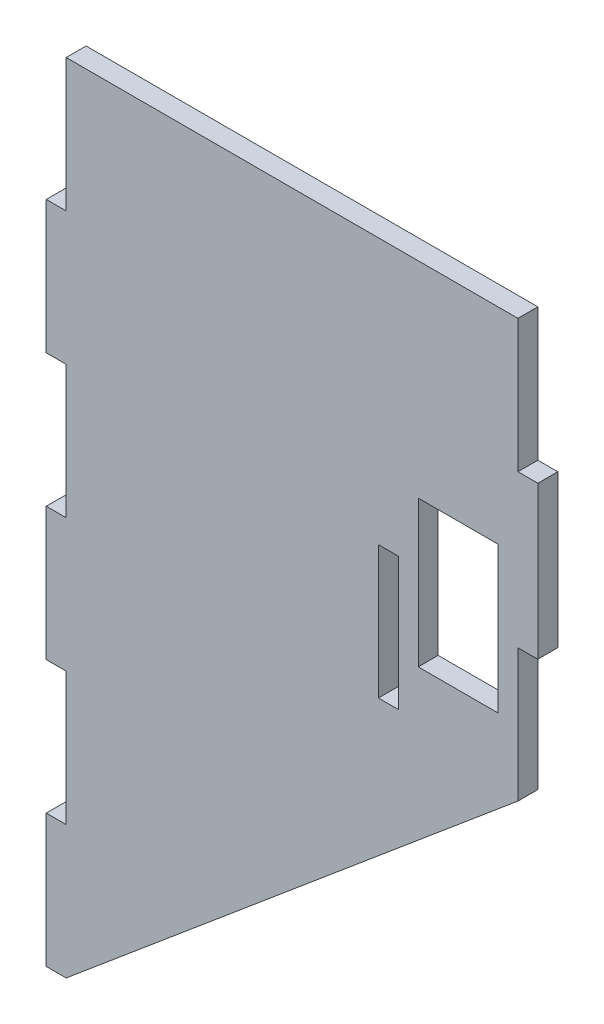
ISO-10303-21;
HEADER;
FILE_DESCRIPTION(('STEP AP214'),'2;1');
FILE_NAME('part.step','',(''),(''),'','','');
FILE_SCHEMA(('AUTOMOTIVE_DESIGN { 1 0 10303 214 1 1 1 1 }'));
ENDSEC;
DATA;
#1=APPLICATION_CONTEXT('core data for automotive mechanical design processes');
#2=APPLICATION_PROTOCOL_DEFINITION('international standard','automotive_design',2000,#1);
#3=PRODUCT_CONTEXT('',#1,'mechanical');
#4=PRODUCT('Part','Part','',(#3));
#5=PRODUCT_RELATED_PRODUCT_CATEGORY('part','',(#4));
#6=PRODUCT_DEFINITION_FORMATION('','',#4);
#7=PRODUCT_DEFINITION_CONTEXT('part definition',#1,'design');
#8=PRODUCT_DEFINITION('design','',#6,#7);
#9=PRODUCT_DEFINITION_SHAPE('','',#8);
#10=(LENGTH_UNIT() NAMED_UNIT(*) SI_UNIT(.MILLI.,.METRE.));
#11=(NAMED_UNIT(*) PLANE_ANGLE_UNIT() SI_UNIT($,.RADIAN.));
#12=(NAMED_UNIT(*) SI_UNIT($,.STERADIAN.) SOLID_ANGLE_UNIT());
#13=UNCERTAINTY_MEASURE_WITH_UNIT(LENGTH_MEASURE(1.E-05),#10,'distance_accuracy_value','');
#14=(GEOMETRIC_REPRESENTATION_CONTEXT(3) GLOBAL_UNCERTAINTY_ASSIGNED_CONTEXT((#13)) GLOBAL_UNIT_ASSIGNED_CONTEXT((#10,
#11,#12)) REPRESENTATION_CONTEXT('',''));
#15=CARTESIAN_POINT('',(0.,0.,0.));
#16=DIRECTION('',(0.,0.,1.));
#17=DIRECTION('',(1.,0.,0.));
#18=AXIS2_PLACEMENT_3D('',#15,#16,#17);
#19=CARTESIAN_POINT('',(0.,0.,3.));
#20=DIRECTION('',(0.,0.,-1.));
#21=DIRECTION('',(-1.,0.,0.));
#22=AXIS2_PLACEMENT_3D('',#19,#20,#21);
#23=PLANE('',#22);
#24=DIRECTION('',(0.,-1.,0.));
#25=VECTOR('',#24,1.);
#26=CARTESIAN_POINT('',(53.,89.0587749200552,3.));
#27=LINE('',#26,#25);
#28=CARTESIAN_POINT('',(53.,89.0587749200552,3.));
#29=VERTEX_POINT('',#28);
#30=CARTESIAN_POINT('',(53.,67.0587749200552,3.));
#31=VERTEX_POINT('',#30);
#32=EDGE_CURVE('E252',#29,#31,#27,.T.);
#33=ORIENTED_EDGE('',*,*,#32,.F.);
#34=DIRECTION('',(-1.,0.,0.));
#35=VECTOR('',#34,1.);
#36=CARTESIAN_POINT('',(53.,89.0587749200552,3.));
#37=LINE('',#36,#35);
#38=CARTESIAN_POINT('',(65.,89.0587749200552,3.));
#39=VERTEX_POINT('',#38);
#40=EDGE_CURVE('E260',#39,#29,#37,.T.);
#41=ORIENTED_EDGE('',*,*,#40,.F.);
#42=DIRECTION('',(0.,1.,0.));
#43=VECTOR('',#42,1.);
#44=CARTESIAN_POINT('',(65.,89.0587749200552,3.));
#45=LINE('',#44,#43);
#46=CARTESIAN_POINT('',(65.,67.0587749200552,3.));
#47=VERTEX_POINT('',#46);
#48=EDGE_CURVE('E257',#47,#39,#45,.T.);
#49=ORIENTED_EDGE('',*,*,#48,.F.);
#50=DIRECTION('',(1.,0.,0.));
#51=VECTOR('',#50,1.);
#52=CARTESIAN_POINT('',(53.,67.0587749200552,3.));
#53=LINE('',#52,#51);
#54=EDGE_CURVE('E254',#31,#47,#53,.T.);
#55=ORIENTED_EDGE('',*,*,#54,.F.);
#56=EDGE_LOOP('',(#33,#41,#49,#55));
#57=FACE_BOUND('',#56,.T.);
#58=DIRECTION('',(1.,0.,0.));
#59=VECTOR('',#58,1.);
#60=CARTESIAN_POINT('',(-3.00000000000001,40.,3.));
#61=LINE('',#60,#59);
#62=CARTESIAN_POINT('',(-3.00000000000001,40.,3.));
#63=VERTEX_POINT('',#62);
#64=CARTESIAN_POINT('',(0.,40.,3.));
#65=VERTEX_POINT('',#64);
#66=EDGE_CURVE('E283',#63,#65,#61,.T.);
#67=ORIENTED_EDGE('',*,*,#66,.T.);
#68=DIRECTION('',(0.,-1.,0.));
#69=VECTOR('',#68,1.);
#70=CARTESIAN_POINT('',(0.,40.,3.));
#71=LINE('',#70,#69);
#72=CARTESIAN_POINT('',(0.,20.,3.));
#73=VERTEX_POINT('',#72);
#74=EDGE_CURVE('E286',#65,#73,#71,.T.);
#75=ORIENTED_EDGE('',*,*,#74,.T.);
#76=DIRECTION('',(-1.,0.,0.));
#77=VECTOR('',#76,1.);
#78=CARTESIAN_POINT('',(0.,20.,3.));
#79=LINE('',#78,#77);
#80=CARTESIAN_POINT('',(-3.,20.,3.));
#81=VERTEX_POINT('',#80);
#82=EDGE_CURVE('E289',#73,#81,#79,.T.);
#83=ORIENTED_EDGE('',*,*,#82,.T.);
#84=DIRECTION('',(0.,-1.,0.));
#85=VECTOR('',#84,1.);
#86=CARTESIAN_POINT('',(-3.,20.,3.));
#87=LINE('',#86,#85);
#88=CARTESIAN_POINT('',(-3.,0.,3.));
#89=VERTEX_POINT('',#88);
#90=EDGE_CURVE('E291',#81,#89,#87,.T.);
#91=ORIENTED_EDGE('',*,*,#90,.T.);
#92=DIRECTION('',(1.,0.,0.));
#93=VECTOR('',#92,1.);
#94=CARTESIAN_POINT('',(-3.,0.,3.));
#95=LINE('',#94,#93);
#96=CARTESIAN_POINT('',(0.,0.,3.));
#97=VERTEX_POINT('',#96);
#98=EDGE_CURVE('E293',#89,#97,#95,.T.);
#99=ORIENTED_EDGE('',*,*,#98,.T.);
#100=DIRECTION('',(0.766044443118977,0.642787609686541,0.));
#101=VECTOR('',#100,1.);
#102=CARTESIAN_POINT('',(0.,0.,3.));
#103=LINE('',#102,#101);
#104=CARTESIAN_POINT('',(68.,57.0587749200552,3.));
#105=VERTEX_POINT('',#104);
#106=EDGE_CURVE('E295',#97,#105,#103,.T.);
#107=ORIENTED_EDGE('',*,*,#106,.T.);
#108=DIRECTION('',(0.,1.,0.));
#109=VECTOR('',#108,1.);
#110=CARTESIAN_POINT('',(68.,57.0587749200552,3.));
#111=LINE('',#110,#109);
#112=CARTESIAN_POINT('',(68.,77.0587749200552,3.));
#113=VERTEX_POINT('',#112);
#114=EDGE_CURVE('E297',#105,#113,#111,.T.);
#115=ORIENTED_EDGE('',*,*,#114,.T.);
#116=DIRECTION('',(1.,0.,0.));
#117=VECTOR('',#116,1.);
#118=CARTESIAN_POINT('',(68.,77.0587749200552,3.));
#119=LINE('',#118,#117);
#120=CARTESIAN_POINT('',(71.,77.0587749200552,3.));
#121=VERTEX_POINT('',#120);
#122=EDGE_CURVE('E299',#113,#121,#119,.T.);
#123=ORIENTED_EDGE('',*,*,#122,.T.);
#124=DIRECTION('',(0.,1.,0.));
#125=VECTOR('',#124,1.);
#126=CARTESIAN_POINT('',(71.,77.0587749200552,3.));
#127=LINE('',#126,#125);
#128=CARTESIAN_POINT('',(71.,100.,3.));
#129=VERTEX_POINT('',#128);
#130=EDGE_CURVE('E301',#121,#129,#127,.T.);
#131=ORIENTED_EDGE('',*,*,#130,.T.);
#132=DIRECTION('',(-1.,0.,0.));
#133=VECTOR('',#132,1.);
#134=CARTESIAN_POINT('',(71.,100.,3.));
#135=LINE('',#134,#133);
#136=CARTESIAN_POINT('',(68.,100.,3.));
#137=VERTEX_POINT('',#136);
#138=EDGE_CURVE('E303',#129,#137,#135,.T.);
#139=ORIENTED_EDGE('',*,*,#138,.T.);
#140=DIRECTION('',(0.,1.,0.));
#141=VECTOR('',#140,1.);
#142=CARTESIAN_POINT('',(68.,100.,3.));
#143=LINE('',#142,#141);
#144=CARTESIAN_POINT('',(68.,120.,3.));
#145=VERTEX_POINT('',#144);
#146=EDGE_CURVE('E305',#137,#145,#143,.T.);
#147=ORIENTED_EDGE('',*,*,#146,.T.);
#148=DIRECTION('',(-1.,0.,0.));
#149=VECTOR('',#148,1.);
#150=CARTESIAN_POINT('',(23.5,120.,3.));
#151=LINE('',#150,#149);
#152=CARTESIAN_POINT('',(0.,120.,3.));
#153=VERTEX_POINT('',#152);
#154=EDGE_CURVE('E307',#145,#153,#151,.T.);
#155=ORIENTED_EDGE('',*,*,#154,.T.);
#156=DIRECTION('',(0.,-1.,0.));
#157=VECTOR('',#156,1.);
#158=CARTESIAN_POINT('',(0.,100.,3.));
#159=LINE('',#158,#157);
#160=CARTESIAN_POINT('',(0.,100.,3.));
#161=VERTEX_POINT('',#160);
#162=EDGE_CURVE('E309',#153,#161,#159,.T.);
#163=ORIENTED_EDGE('',*,*,#162,.T.);
#164=DIRECTION('',(-1.,0.,0.));
#165=VECTOR('',#164,1.);
#166=CARTESIAN_POINT('',(-3.00000000000001,100.,3.));
#167=LINE('',#166,#165);
#168=CARTESIAN_POINT('',(-3.00000000000001,100.,3.));
#169=VERTEX_POINT('',#168);
#170=EDGE_CURVE('E311',#161,#169,#167,.T.);
#171=ORIENTED_EDGE('',*,*,#170,.T.);
#172=DIRECTION('',(0.,-1.,0.));
#173=VECTOR('',#172,1.);
#174=CARTESIAN_POINT('',(-3.,80.,3.));
#175=LINE('',#174,#173);
#176=CARTESIAN_POINT('',(-3.,80.,3.));
#177=VERTEX_POINT('',#176);
#178=EDGE_CURVE('E313',#169,#177,#175,.T.);
#179=ORIENTED_EDGE('',*,*,#178,.T.);
#180=DIRECTION('',(1.,0.,0.));
#181=VECTOR('',#180,1.);
#182=CARTESIAN_POINT('',(0.,80.,3.));
#183=LINE('',#182,#181);
#184=CARTESIAN_POINT('',(0.,80.,3.));
#185=VERTEX_POINT('',#184);
#186=EDGE_CURVE('E315',#177,#185,#183,.T.);
#187=ORIENTED_EDGE('',*,*,#186,.T.);
#188=DIRECTION('',(0.,-1.,0.));
#189=VECTOR('',#188,1.);
#190=CARTESIAN_POINT('',(0.,60.,3.));
#191=LINE('',#190,#189);
#192=CARTESIAN_POINT('',(0.,60.,3.));
#193=VERTEX_POINT('',#192);
#194=EDGE_CURVE('E317',#185,#193,#191,.T.);
#195=ORIENTED_EDGE('',*,*,#194,.T.);
#196=DIRECTION('',(-1.,0.,0.));
#197=VECTOR('',#196,1.);
#198=CARTESIAN_POINT('',(-3.00000000000001,60.,3.));
#199=LINE('',#198,#197);
#200=CARTESIAN_POINT('',(-3.00000000000001,60.,3.));
#201=VERTEX_POINT('',#200);
#202=EDGE_CURVE('E319',#193,#201,#199,.T.);
#203=ORIENTED_EDGE('',*,*,#202,.T.);
#204=DIRECTION('',(0.,-1.,0.));
#205=VECTOR('',#204,1.);
#206=CARTESIAN_POINT('',(-3.00000000000001,60.,3.));
#207=LINE('',#206,#205);
#208=EDGE_CURVE('E321',#201,#63,#207,.T.);
#209=ORIENTED_EDGE('',*,*,#208,.T.);
#210=EDGE_LOOP('',(#67,#75,#83,#91,#99,#107,#115,#123,#131,#139,#147,#155,#163,#171,#179,#187,
#195,#203,#209));
#211=FACE_BOUND('',#210,.T.);
#212=DIRECTION('',(0.,1.,0.));
#213=VECTOR('',#212,1.);
#214=CARTESIAN_POINT('',(50.,60.,3.));
#215=LINE('',#214,#213);
#216=CARTESIAN_POINT('',(50.,60.,3.));
#217=VERTEX_POINT('',#216);
#218=CARTESIAN_POINT('',(50.,80.,3.));
#219=VERTEX_POINT('',#218);
#220=EDGE_CURVE('E216',#217,#219,#215,.T.);
#221=ORIENTED_EDGE('',*,*,#220,.F.);
#222=DIRECTION('',(1.,0.,0.));
#223=VECTOR('',#222,1.);
#224=CARTESIAN_POINT('',(50.,60.,3.));
#225=LINE('',#224,#223);
#226=CARTESIAN_POINT('',(47.,60.,3.));
#227=VERTEX_POINT('',#226);
#228=EDGE_CURVE('E238',#227,#217,#225,.T.);
#229=ORIENTED_EDGE('',*,*,#228,.F.);
#230=DIRECTION('',(0.,-1.,0.));
#231=VECTOR('',#230,1.);
#232=CARTESIAN_POINT('',(47.,60.,3.));
#233=LINE('',#232,#231);
#234=CARTESIAN_POINT('',(47.,80.,3.));
#235=VERTEX_POINT('',#234);
#236=EDGE_CURVE('E236',#235,#227,#233,.T.);
#237=ORIENTED_EDGE('',*,*,#236,.F.);
#238=DIRECTION('',(-1.,0.,0.));
#239=VECTOR('',#238,1.);
#240=CARTESIAN_POINT('',(47.,80.,3.));
#241=LINE('',#240,#239);
#242=EDGE_CURVE('E224',#219,#235,#241,.T.);
#243=ORIENTED_EDGE('',*,*,#242,.F.);
#244=EDGE_LOOP('',(#221,#229,#237,#243));
#245=FACE_BOUND('',#244,.T.);
#246=ADVANCED_FACE('F37',(#57,#211,#245),#23,.F.);
#247=CARTESIAN_POINT('',(0.,0.,0.));
#248=DIRECTION('',(0.,0.,-1.));
#249=DIRECTION('',(-1.,0.,0.));
#250=AXIS2_PLACEMENT_3D('',#247,#248,#249);
#251=PLANE('',#250);
#252=DIRECTION('',(1.,0.,0.));
#253=VECTOR('',#252,1.);
#254=CARTESIAN_POINT('',(-3.00000000000001,40.,0.));
#255=LINE('',#254,#253);
#256=CARTESIAN_POINT('',(-3.00000000000001,40.,0.));
#257=VERTEX_POINT('',#256);
#258=CARTESIAN_POINT('',(0.,40.,0.));
#259=VERTEX_POINT('',#258);
#260=EDGE_CURVE('E282',#257,#259,#255,.T.);
#261=ORIENTED_EDGE('',*,*,#260,.F.);
#262=DIRECTION('',(0.,-1.,0.));
#263=VECTOR('',#262,1.);
#264=CARTESIAN_POINT('',(-3.00000000000001,60.,0.));
#265=LINE('',#264,#263);
#266=CARTESIAN_POINT('',(-3.00000000000001,60.,0.));
#267=VERTEX_POINT('',#266);
#268=EDGE_CURVE('E287',#267,#257,#265,.T.);
#269=ORIENTED_EDGE('',*,*,#268,.F.);
#270=DIRECTION('',(-1.,0.,0.));
#271=VECTOR('',#270,1.);
#272=CARTESIAN_POINT('',(-3.00000000000001,60.,0.));
#273=LINE('',#272,#271);
#274=CARTESIAN_POINT('',(0.,60.,0.));
#275=VERTEX_POINT('',#274);
#276=EDGE_CURVE('E359',#275,#267,#273,.T.);
#277=ORIENTED_EDGE('',*,*,#276,.F.);
#278=DIRECTION('',(0.,-1.,0.));
#279=VECTOR('',#278,1.);
#280=CARTESIAN_POINT('',(0.,60.,0.));
#281=LINE('',#280,#279);
#282=CARTESIAN_POINT('',(0.,80.,0.));
#283=VERTEX_POINT('',#282);
#284=EDGE_CURVE('E357',#283,#275,#281,.T.);
#285=ORIENTED_EDGE('',*,*,#284,.F.);
#286=DIRECTION('',(1.,0.,0.));
#287=VECTOR('',#286,1.);
#288=CARTESIAN_POINT('',(0.,80.,0.));
#289=LINE('',#288,#287);
#290=CARTESIAN_POINT('',(-3.,80.,0.));
#291=VERTEX_POINT('',#290);
#292=EDGE_CURVE('E355',#291,#283,#289,.T.);
#293=ORIENTED_EDGE('',*,*,#292,.F.);
#294=DIRECTION('',(0.,-1.,0.));
#295=VECTOR('',#294,1.);
#296=CARTESIAN_POINT('',(-3.,80.,0.));
#297=LINE('',#296,#295);
#298=CARTESIAN_POINT('',(-3.00000000000001,100.,0.));
#299=VERTEX_POINT('',#298);
#300=EDGE_CURVE('E353',#299,#291,#297,.T.);
#301=ORIENTED_EDGE('',*,*,#300,.F.);
#302=DIRECTION('',(-1.,0.,0.));
#303=VECTOR('',#302,1.);
#304=CARTESIAN_POINT('',(-3.00000000000001,100.,0.));
#305=LINE('',#304,#303);
#306=CARTESIAN_POINT('',(0.,100.,0.));
#307=VERTEX_POINT('',#306);
#308=EDGE_CURVE('E351',#307,#299,#305,.T.);
#309=ORIENTED_EDGE('',*,*,#308,.F.);
#310=DIRECTION('',(0.,-1.,0.));
#311=VECTOR('',#310,1.);
#312=CARTESIAN_POINT('',(0.,100.,0.));
#313=LINE('',#312,#311);
#314=CARTESIAN_POINT('',(0.,120.,0.));
#315=VERTEX_POINT('',#314);
#316=EDGE_CURVE('E349',#315,#307,#313,.T.);
#317=ORIENTED_EDGE('',*,*,#316,.F.);
#318=DIRECTION('',(-1.,0.,0.));
#319=VECTOR('',#318,1.);
#320=CARTESIAN_POINT('',(0.,120.,0.));
#321=LINE('',#320,#319);
#322=CARTESIAN_POINT('',(68.,120.,0.));
#323=VERTEX_POINT('',#322);
#324=EDGE_CURVE('E347',#323,#315,#321,.T.);
#325=ORIENTED_EDGE('',*,*,#324,.F.);
#326=DIRECTION('',(0.,1.,0.));
#327=VECTOR('',#326,1.);
#328=CARTESIAN_POINT('',(68.,100.,0.));
#329=LINE('',#328,#327);
#330=CARTESIAN_POINT('',(68.,100.,0.));
#331=VERTEX_POINT('',#330);
#332=EDGE_CURVE('E344',#331,#323,#329,.T.);
#333=ORIENTED_EDGE('',*,*,#332,.F.);
#334=DIRECTION('',(-1.,0.,0.));
#335=VECTOR('',#334,1.);
#336=CARTESIAN_POINT('',(71.,100.,0.));
#337=LINE('',#336,#335);
#338=CARTESIAN_POINT('',(71.,100.,0.));
#339=VERTEX_POINT('',#338);
#340=EDGE_CURVE('E342',#339,#331,#337,.T.);
#341=ORIENTED_EDGE('',*,*,#340,.F.);
#342=DIRECTION('',(0.,1.,0.));
#343=VECTOR('',#342,1.);
#344=CARTESIAN_POINT('',(71.,77.0587749200552,0.));
#345=LINE('',#344,#343);
#346=CARTESIAN_POINT('',(71.,77.0587749200552,0.));
#347=VERTEX_POINT('',#346);
#348=EDGE_CURVE('E340',#347,#339,#345,.T.);
#349=ORIENTED_EDGE('',*,*,#348,.F.);
#350=DIRECTION('',(1.,0.,0.));
#351=VECTOR('',#350,1.);
#352=CARTESIAN_POINT('',(68.,77.0587749200552,0.));
#353=LINE('',#352,#351);
#354=CARTESIAN_POINT('',(68.,77.0587749200552,0.));
#355=VERTEX_POINT('',#354);
#356=EDGE_CURVE('E338',#355,#347,#353,.T.);
#357=ORIENTED_EDGE('',*,*,#356,.F.);
#358=DIRECTION('',(0.,1.,0.));
#359=VECTOR('',#358,1.);
#360=CARTESIAN_POINT('',(68.,57.0587749200552,0.));
#361=LINE('',#360,#359);
#362=CARTESIAN_POINT('',(68.,57.0587749200552,0.));
#363=VERTEX_POINT('',#362);
#364=EDGE_CURVE('E336',#363,#355,#361,.T.);
#365=ORIENTED_EDGE('',*,*,#364,.F.);
#366=DIRECTION('',(0.766044443118977,0.642787609686541,0.));
#367=VECTOR('',#366,1.);
#368=CARTESIAN_POINT('',(0.,0.,0.));
#369=LINE('',#368,#367);
#370=CARTESIAN_POINT('',(0.,0.,0.));
#371=VERTEX_POINT('',#370);
#372=EDGE_CURVE('E334',#371,#363,#369,.T.);
#373=ORIENTED_EDGE('',*,*,#372,.F.);
#374=DIRECTION('',(1.,0.,0.));
#375=VECTOR('',#374,1.);
#376=CARTESIAN_POINT('',(-3.,0.,0.));
#377=LINE('',#376,#375);
#378=CARTESIAN_POINT('',(-3.,0.,0.));
#379=VERTEX_POINT('',#378);
#380=EDGE_CURVE('E332',#379,#371,#377,.T.);
#381=ORIENTED_EDGE('',*,*,#380,.F.);
#382=DIRECTION('',(0.,-1.,0.));
#383=VECTOR('',#382,1.);
#384=CARTESIAN_POINT('',(-3.,20.,0.));
#385=LINE('',#384,#383);
#386=CARTESIAN_POINT('',(-3.,20.,0.));
#387=VERTEX_POINT('',#386);
#388=EDGE_CURVE('E330',#387,#379,#385,.T.);
#389=ORIENTED_EDGE('',*,*,#388,.F.);
#390=DIRECTION('',(-1.,0.,0.));
#391=VECTOR('',#390,1.);
#392=CARTESIAN_POINT('',(0.,20.,0.));
#393=LINE('',#392,#391);
#394=CARTESIAN_POINT('',(0.,20.,0.));
#395=VERTEX_POINT('',#394);
#396=EDGE_CURVE('E328',#395,#387,#393,.T.);
#397=ORIENTED_EDGE('',*,*,#396,.F.);
#398=DIRECTION('',(0.,-1.,0.));
#399=VECTOR('',#398,1.);
#400=CARTESIAN_POINT('',(0.,40.,0.));
#401=LINE('',#400,#399);
#402=EDGE_CURVE('E326',#259,#395,#401,.T.);
#403=ORIENTED_EDGE('',*,*,#402,.F.);
#404=EDGE_LOOP('',(#261,#269,#277,#285,#293,#301,#309,#317,#325,#333,#341,#349,#357,#365,#373,
#381,#389,#397,#403));
#405=FACE_BOUND('',#404,.T.);
#406=DIRECTION('',(-1.,0.,0.));
#407=VECTOR('',#406,1.);
#408=CARTESIAN_POINT('',(53.,89.0587749200552,0.));
#409=LINE('',#408,#407);
#410=CARTESIAN_POINT('',(65.,89.0587749200552,0.));
#411=VERTEX_POINT('',#410);
#412=CARTESIAN_POINT('',(53.,89.0587749200552,0.));
#413=VERTEX_POINT('',#412);
#414=EDGE_CURVE('E255',#411,#413,#409,.T.);
#415=ORIENTED_EDGE('',*,*,#414,.T.);
#416=DIRECTION('',(0.,-1.,0.));
#417=VECTOR('',#416,1.);
#418=CARTESIAN_POINT('',(53.,89.0587749200552,0.));
#419=LINE('',#418,#417);
#420=CARTESIAN_POINT('',(53.,67.0587749200552,0.));
#421=VERTEX_POINT('',#420);
#422=EDGE_CURVE('E232',#413,#421,#419,.T.);
#423=ORIENTED_EDGE('',*,*,#422,.T.);
#424=DIRECTION('',(1.,0.,0.));
#425=VECTOR('',#424,1.);
#426=CARTESIAN_POINT('',(53.,67.0587749200552,0.));
#427=LINE('',#426,#425);
#428=CARTESIAN_POINT('',(65.,67.0587749200552,0.));
#429=VERTEX_POINT('',#428);
#430=EDGE_CURVE('E265',#421,#429,#427,.T.);
#431=ORIENTED_EDGE('',*,*,#430,.T.);
#432=DIRECTION('',(0.,1.,0.));
#433=VECTOR('',#432,1.);
#434=CARTESIAN_POINT('',(65.,89.0587749200552,0.));
#435=LINE('',#434,#433);
#436=EDGE_CURVE('E268',#429,#411,#435,.T.);
#437=ORIENTED_EDGE('',*,*,#436,.T.);
#438=EDGE_LOOP('',(#415,#423,#431,#437));
#439=FACE_BOUND('',#438,.T.);
#440=DIRECTION('',(1.,0.,0.));
#441=VECTOR('',#440,1.);
#442=CARTESIAN_POINT('',(50.,60.,0.));
#443=LINE('',#442,#441);
#444=CARTESIAN_POINT('',(47.,60.,0.));
#445=VERTEX_POINT('',#444);
#446=CARTESIAN_POINT('',(50.,60.,0.));
#447=VERTEX_POINT('',#446);
#448=EDGE_CURVE('E225',#445,#447,#443,.T.);
#449=ORIENTED_EDGE('',*,*,#448,.T.);
#450=DIRECTION('',(0.,1.,0.));
#451=VECTOR('',#450,1.);
#452=CARTESIAN_POINT('',(50.,60.,0.));
#453=LINE('',#452,#451);
#454=CARTESIAN_POINT('',(50.,80.,0.));
#455=VERTEX_POINT('',#454);
#456=EDGE_CURVE('E60',#447,#455,#453,.T.);
#457=ORIENTED_EDGE('',*,*,#456,.T.);
#458=DIRECTION('',(-1.,0.,0.));
#459=VECTOR('',#458,1.);
#460=CARTESIAN_POINT('',(47.,80.,0.));
#461=LINE('',#460,#459);
#462=CARTESIAN_POINT('',(47.,80.,0.));
#463=VERTEX_POINT('',#462);
#464=EDGE_CURVE('E231',#455,#463,#461,.T.);
#465=ORIENTED_EDGE('',*,*,#464,.T.);
#466=DIRECTION('',(0.,-1.,0.));
#467=VECTOR('',#466,1.);
#468=CARTESIAN_POINT('',(47.,60.,0.));
#469=LINE('',#468,#467);
#470=EDGE_CURVE('E244',#463,#445,#469,.T.);
#471=ORIENTED_EDGE('',*,*,#470,.T.);
#472=EDGE_LOOP('',(#449,#457,#465,#471));
#473=FACE_BOUND('',#472,.T.);
#474=ADVANCED_FACE('F422',(#405,#439,#473),#251,.T.);
#475=CARTESIAN_POINT('',(-3.00000000000001,40.,3.));
#476=DIRECTION('',(0.,1.,0.));
#477=DIRECTION('',(0.,0.,1.));
#478=AXIS2_PLACEMENT_3D('',#475,#476,#477);
#479=PLANE('',#478);
#480=ORIENTED_EDGE('',*,*,#260,.T.);
#481=DIRECTION('',(0.,0.,-1.));
#482=VECTOR('',#481,1.);
#483=CARTESIAN_POINT('',(0.,40.,3.));
#484=LINE('',#483,#482);
#485=EDGE_CURVE('E11',#65,#259,#484,.T.);
#486=ORIENTED_EDGE('',*,*,#485,.F.);
#487=ORIENTED_EDGE('',*,*,#66,.F.);
#488=DIRECTION('',(0.,0.,-1.));
#489=VECTOR('',#488,1.);
#490=CARTESIAN_POINT('',(-3.00000000000001,40.,3.));
#491=LINE('',#490,#489);
#492=EDGE_CURVE('E323',#63,#257,#491,.T.);
#493=ORIENTED_EDGE('',*,*,#492,.T.);
#494=EDGE_LOOP('',(#480,#486,#487,#493));
#495=FACE_BOUND('',#494,.T.);
#496=ADVANCED_FACE('F39',(#495),#479,.F.);
#497=CARTESIAN_POINT('',(0.,40.,3.));
#498=DIRECTION('',(1.,0.,0.));
#499=DIRECTION('',(0.,0.,-1.));
#500=AXIS2_PLACEMENT_3D('',#497,#498,#499);
#501=PLANE('',#500);
#502=ORIENTED_EDGE('',*,*,#402,.T.);
#503=DIRECTION('',(0.,0.,-1.));
#504=VECTOR('',#503,1.);
#505=CARTESIAN_POINT('',(0.,20.,3.));
#506=LINE('',#505,#504);
#507=EDGE_CURVE('E45',#73,#395,#506,.T.);
#508=ORIENTED_EDGE('',*,*,#507,.F.);
#509=ORIENTED_EDGE('',*,*,#74,.F.);
#510=ORIENTED_EDGE('',*,*,#485,.T.);
#511=EDGE_LOOP('',(#502,#508,#509,#510));
#512=FACE_BOUND('',#511,.T.);
#513=ADVANCED_FACE('F439',(#512),#501,.F.);
#514=CARTESIAN_POINT('',(0.,20.,3.));
#515=DIRECTION('',(0.,-1.,0.));
#516=DIRECTION('',(1.,0.,0.));
#517=AXIS2_PLACEMENT_3D('',#514,#515,#516);
#518=PLANE('',#517);
#519=ORIENTED_EDGE('',*,*,#396,.T.);
#520=DIRECTION('',(0.,0.,-1.));
#521=VECTOR('',#520,1.);
#522=CARTESIAN_POINT('',(-3.,20.,3.));
#523=LINE('',#522,#521);
#524=EDGE_CURVE('E409',#81,#387,#523,.T.);
#525=ORIENTED_EDGE('',*,*,#524,.F.);
#526=ORIENTED_EDGE('',*,*,#82,.F.);
#527=ORIENTED_EDGE('',*,*,#507,.T.);
#528=EDGE_LOOP('',(#519,#525,#526,#527));
#529=FACE_BOUND('',#528,.T.);
#530=ADVANCED_FACE('F416',(#529),#518,.F.);
#531=CARTESIAN_POINT('',(-3.,20.,3.));
#532=DIRECTION('',(1.,0.,0.));
#533=DIRECTION('',(0.,1.,0.));
#534=AXIS2_PLACEMENT_3D('',#531,#532,#533);
#535=PLANE('',#534);
#536=ORIENTED_EDGE('',*,*,#388,.T.);
#537=DIRECTION('',(0.,0.,-1.));
#538=VECTOR('',#537,1.);
#539=CARTESIAN_POINT('',(-3.,0.,3.));
#540=LINE('',#539,#538);
#541=EDGE_CURVE('E406',#89,#379,#540,.T.);
#542=ORIENTED_EDGE('',*,*,#541,.F.);
#543=ORIENTED_EDGE('',*,*,#90,.F.);
#544=ORIENTED_EDGE('',*,*,#524,.T.);
#545=EDGE_LOOP('',(#536,#542,#543,#544));
#546=FACE_BOUND('',#545,.T.);
#547=ADVANCED_FACE('F428',(#546),#535,.F.);
#548=CARTESIAN_POINT('',(-3.,0.,3.));
#549=DIRECTION('',(0.,1.,0.));
#550=DIRECTION('',(0.,0.,1.));
#551=AXIS2_PLACEMENT_3D('',#548,#549,#550);
#552=PLANE('',#551);
#553=ORIENTED_EDGE('',*,*,#380,.T.);
#554=DIRECTION('',(0.,0.,-1.));
#555=VECTOR('',#554,1.);
#556=CARTESIAN_POINT('',(0.,0.,3.));
#557=LINE('',#556,#555);
#558=EDGE_CURVE('E403',#97,#371,#557,.T.);
#559=ORIENTED_EDGE('',*,*,#558,.F.);
#560=ORIENTED_EDGE('',*,*,#98,.F.);
#561=ORIENTED_EDGE('',*,*,#541,.T.);
#562=EDGE_LOOP('',(#553,#559,#560,#561));
#563=FACE_BOUND('',#562,.T.);
#564=ADVANCED_FACE('F432',(#563),#552,.F.);
#565=CARTESIAN_POINT('',(0.,0.,3.));
#566=DIRECTION('',(-0.642787609686541,0.766044443118977,0.));
#567=DIRECTION('',(-0.766044443118977,-0.642787609686541,0.));
#568=AXIS2_PLACEMENT_3D('',#565,#566,#567);
#569=PLANE('',#568);
#570=ORIENTED_EDGE('',*,*,#372,.T.);
#571=DIRECTION('',(0.,0.,-1.));
#572=VECTOR('',#571,1.);
#573=CARTESIAN_POINT('',(68.,57.0587749200552,3.));
#574=LINE('',#573,#572);
#575=EDGE_CURVE('E400',#105,#363,#574,.T.);
#576=ORIENTED_EDGE('',*,*,#575,.F.);
#577=ORIENTED_EDGE('',*,*,#106,.F.);
#578=ORIENTED_EDGE('',*,*,#558,.T.);
#579=EDGE_LOOP('',(#570,#576,#577,#578));
#580=FACE_BOUND('',#579,.T.);
#581=ADVANCED_FACE('F506',(#580),#569,.F.);
#582=CARTESIAN_POINT('',(68.,57.0587749200552,3.));
#583=DIRECTION('',(-1.,0.,0.));
#584=DIRECTION('',(0.,0.,1.));
#585=AXIS2_PLACEMENT_3D('',#582,#583,#584);
#586=PLANE('',#585);
#587=ORIENTED_EDGE('',*,*,#364,.T.);
#588=DIRECTION('',(0.,0.,-1.));
#589=VECTOR('',#588,1.);
#590=CARTESIAN_POINT('',(68.,77.0587749200552,3.));
#591=LINE('',#590,#589);
#592=EDGE_CURVE('E397',#113,#355,#591,.T.);
#593=ORIENTED_EDGE('',*,*,#592,.F.);
#594=ORIENTED_EDGE('',*,*,#114,.F.);
#595=ORIENTED_EDGE('',*,*,#575,.T.);
#596=EDGE_LOOP('',(#587,#593,#594,#595));
#597=FACE_BOUND('',#596,.T.);
#598=ADVANCED_FACE('F503',(#597),#586,.F.);
#599=CARTESIAN_POINT('',(68.,77.0587749200552,3.));
#600=DIRECTION('',(0.,1.,0.));
#601=DIRECTION('',(-1.,0.,0.));
#602=AXIS2_PLACEMENT_3D('',#599,#600,#601);
#603=PLANE('',#602);
#604=ORIENTED_EDGE('',*,*,#356,.T.);
#605=DIRECTION('',(0.,0.,-1.));
#606=VECTOR('',#605,1.);
#607=CARTESIAN_POINT('',(71.,77.0587749200552,3.));
#608=LINE('',#607,#606);
#609=EDGE_CURVE('E394',#121,#347,#608,.T.);
#610=ORIENTED_EDGE('',*,*,#609,.F.);
#611=ORIENTED_EDGE('',*,*,#122,.F.);
#612=ORIENTED_EDGE('',*,*,#592,.T.);
#613=EDGE_LOOP('',(#604,#610,#611,#612));
#614=FACE_BOUND('',#613,.T.);
#615=ADVANCED_FACE('F499',(#614),#603,.F.);
#616=CARTESIAN_POINT('',(71.,77.0587749200552,3.));
#617=DIRECTION('',(-1.,0.,0.));
#618=DIRECTION('',(0.,0.,1.));
#619=AXIS2_PLACEMENT_3D('',#616,#617,#618);
#620=PLANE('',#619);
#621=ORIENTED_EDGE('',*,*,#348,.T.);
#622=DIRECTION('',(0.,0.,-1.));
#623=VECTOR('',#622,1.);
#624=CARTESIAN_POINT('',(71.,100.,3.));
#625=LINE('',#624,#623);
#626=EDGE_CURVE('E391',#129,#339,#625,.T.);
#627=ORIENTED_EDGE('',*,*,#626,.F.);
#628=ORIENTED_EDGE('',*,*,#130,.F.);
#629=ORIENTED_EDGE('',*,*,#609,.T.);
#630=EDGE_LOOP('',(#621,#627,#628,#629));
#631=FACE_BOUND('',#630,.T.);
#632=ADVANCED_FACE('F495',(#631),#620,.F.);
#633=CARTESIAN_POINT('',(71.,100.,3.));
#634=DIRECTION('',(0.,-1.,0.));
#635=DIRECTION('',(0.,0.,-1.));
#636=AXIS2_PLACEMENT_3D('',#633,#634,#635);
#637=PLANE('',#636);
#638=ORIENTED_EDGE('',*,*,#340,.T.);
#639=DIRECTION('',(0.,0.,-1.));
#640=VECTOR('',#639,1.);
#641=CARTESIAN_POINT('',(68.,100.,3.));
#642=LINE('',#641,#640);
#643=EDGE_CURVE('E388',#137,#331,#642,.T.);
#644=ORIENTED_EDGE('',*,*,#643,.F.);
#645=ORIENTED_EDGE('',*,*,#138,.F.);
#646=ORIENTED_EDGE('',*,*,#626,.T.);
#647=EDGE_LOOP('',(#638,#644,#645,#646));
#648=FACE_BOUND('',#647,.T.);
#649=ADVANCED_FACE('F490',(#648),#637,.F.);
#650=CARTESIAN_POINT('',(68.,100.,3.));
#651=DIRECTION('',(-1.,0.,0.));
#652=DIRECTION('',(0.,0.,1.));
#653=AXIS2_PLACEMENT_3D('',#650,#651,#652);
#654=PLANE('',#653);
#655=ORIENTED_EDGE('',*,*,#332,.T.);
#656=DIRECTION('',(0.,0.,-1.));
#657=VECTOR('',#656,1.);
#658=CARTESIAN_POINT('',(68.,120.,3.));
#659=LINE('',#658,#657);
#660=EDGE_CURVE('E385',#145,#323,#659,.T.);
#661=ORIENTED_EDGE('',*,*,#660,.F.);
#662=ORIENTED_EDGE('',*,*,#146,.F.);
#663=ORIENTED_EDGE('',*,*,#643,.T.);
#664=EDGE_LOOP('',(#655,#661,#662,#663));
#665=FACE_BOUND('',#664,.T.);
#666=ADVANCED_FACE('F484',(#665),#654,.F.);
#667=CARTESIAN_POINT('',(0.,120.,3.));
#668=DIRECTION('',(0.,-1.,0.));
#669=DIRECTION('',(1.,0.,0.));
#670=AXIS2_PLACEMENT_3D('',#667,#668,#669);
#671=PLANE('',#670);
#672=ORIENTED_EDGE('',*,*,#324,.T.);
#673=DIRECTION('',(0.,0.,-1.));
#674=VECTOR('',#673,1.);
#675=CARTESIAN_POINT('',(0.,120.,3.));
#676=LINE('',#675,#674);
#677=EDGE_CURVE('E382',#153,#315,#676,.T.);
#678=ORIENTED_EDGE('',*,*,#677,.F.);
#679=ORIENTED_EDGE('',*,*,#154,.F.);
#680=ORIENTED_EDGE('',*,*,#660,.T.);
#681=EDGE_LOOP('',(#672,#678,#679,#680));
#682=FACE_BOUND('',#681,.T.);
#683=ADVANCED_FACE('F480',(#682),#671,.F.);
#684=CARTESIAN_POINT('',(0.,100.,3.));
#685=DIRECTION('',(1.,0.,0.));
#686=DIRECTION('',(0.,0.,-1.));
#687=AXIS2_PLACEMENT_3D('',#684,#685,#686);
#688=PLANE('',#687);
#689=ORIENTED_EDGE('',*,*,#316,.T.);
#690=DIRECTION('',(0.,0.,-1.));
#691=VECTOR('',#690,1.);
#692=CARTESIAN_POINT('',(0.,100.,3.));
#693=LINE('',#692,#691);
#694=EDGE_CURVE('E379',#161,#307,#693,.T.);
#695=ORIENTED_EDGE('',*,*,#694,.F.);
#696=ORIENTED_EDGE('',*,*,#162,.F.);
#697=ORIENTED_EDGE('',*,*,#677,.T.);
#698=EDGE_LOOP('',(#689,#695,#696,#697));
#699=FACE_BOUND('',#698,.T.);
#700=ADVANCED_FACE('F475',(#699),#688,.F.);
#701=CARTESIAN_POINT('',(-3.00000000000001,100.,3.));
#702=DIRECTION('',(0.,-1.,0.));
#703=DIRECTION('',(0.,0.,-1.));
#704=AXIS2_PLACEMENT_3D('',#701,#702,#703);
#705=PLANE('',#704);
#706=ORIENTED_EDGE('',*,*,#308,.T.);
#707=DIRECTION('',(0.,0.,-1.));
#708=VECTOR('',#707,1.);
#709=CARTESIAN_POINT('',(-3.00000000000001,100.,3.));
#710=LINE('',#709,#708);
#711=EDGE_CURVE('E376',#169,#299,#710,.T.);
#712=ORIENTED_EDGE('',*,*,#711,.F.);
#713=ORIENTED_EDGE('',*,*,#170,.F.);
#714=ORIENTED_EDGE('',*,*,#694,.T.);
#715=EDGE_LOOP('',(#706,#712,#713,#714));
#716=FACE_BOUND('',#715,.T.);
#717=ADVANCED_FACE('F470',(#716),#705,.F.);
#718=CARTESIAN_POINT('',(-3.,80.,3.));
#719=DIRECTION('',(1.,0.,0.));
#720=DIRECTION('',(0.,1.,0.));
#721=AXIS2_PLACEMENT_3D('',#718,#719,#720);
#722=PLANE('',#721);
#723=ORIENTED_EDGE('',*,*,#300,.T.);
#724=DIRECTION('',(0.,0.,-1.));
#725=VECTOR('',#724,1.);
#726=CARTESIAN_POINT('',(-3.,80.,3.));
#727=LINE('',#726,#725);
#728=EDGE_CURVE('E373',#177,#291,#727,.T.);
#729=ORIENTED_EDGE('',*,*,#728,.F.);
#730=ORIENTED_EDGE('',*,*,#178,.F.);
#731=ORIENTED_EDGE('',*,*,#711,.T.);
#732=EDGE_LOOP('',(#723,#729,#730,#731));
#733=FACE_BOUND('',#732,.T.);
#734=ADVANCED_FACE('F466',(#733),#722,.F.);
#735=CARTESIAN_POINT('',(0.,80.,3.));
#736=DIRECTION('',(0.,1.,0.));
#737=DIRECTION('',(0.,0.,1.));
#738=AXIS2_PLACEMENT_3D('',#735,#736,#737);
#739=PLANE('',#738);
#740=ORIENTED_EDGE('',*,*,#292,.T.);
#741=DIRECTION('',(0.,0.,-1.));
#742=VECTOR('',#741,1.);
#743=CARTESIAN_POINT('',(0.,80.,3.));
#744=LINE('',#743,#742);
#745=EDGE_CURVE('E370',#185,#283,#744,.T.);
#746=ORIENTED_EDGE('',*,*,#745,.F.);
#747=ORIENTED_EDGE('',*,*,#186,.F.);
#748=ORIENTED_EDGE('',*,*,#728,.T.);
#749=EDGE_LOOP('',(#740,#746,#747,#748));
#750=FACE_BOUND('',#749,.T.);
#751=ADVANCED_FACE('F461',(#750),#739,.F.);
#752=CARTESIAN_POINT('',(0.,60.,3.));
#753=DIRECTION('',(1.,0.,0.));
#754=DIRECTION('',(0.,0.,-1.));
#755=AXIS2_PLACEMENT_3D('',#752,#753,#754);
#756=PLANE('',#755);
#757=ORIENTED_EDGE('',*,*,#284,.T.);
#758=DIRECTION('',(0.,0.,-1.));
#759=VECTOR('',#758,1.);
#760=CARTESIAN_POINT('',(0.,60.,3.));
#761=LINE('',#760,#759);
#762=EDGE_CURVE('E367',#193,#275,#761,.T.);
#763=ORIENTED_EDGE('',*,*,#762,.F.);
#764=ORIENTED_EDGE('',*,*,#194,.F.);
#765=ORIENTED_EDGE('',*,*,#745,.T.);
#766=EDGE_LOOP('',(#757,#763,#764,#765));
#767=FACE_BOUND('',#766,.T.);
#768=ADVANCED_FACE('F455',(#767),#756,.F.);
#769=CARTESIAN_POINT('',(-3.00000000000001,60.,3.));
#770=DIRECTION('',(0.,-1.,0.));
#771=DIRECTION('',(0.,0.,-1.));
#772=AXIS2_PLACEMENT_3D('',#769,#770,#771);
#773=PLANE('',#772);
#774=ORIENTED_EDGE('',*,*,#276,.T.);
#775=DIRECTION('',(0.,0.,-1.));
#776=VECTOR('',#775,1.);
#777=CARTESIAN_POINT('',(-3.00000000000001,60.,3.));
#778=LINE('',#777,#776);
#779=EDGE_CURVE('E364',#201,#267,#778,.T.);
#780=ORIENTED_EDGE('',*,*,#779,.F.);
#781=ORIENTED_EDGE('',*,*,#202,.F.);
#782=ORIENTED_EDGE('',*,*,#762,.T.);
#783=EDGE_LOOP('',(#774,#780,#781,#782));
#784=FACE_BOUND('',#783,.T.);
#785=ADVANCED_FACE('F451',(#784),#773,.F.);
#786=CARTESIAN_POINT('',(-3.00000000000001,60.,3.));
#787=DIRECTION('',(1.,0.,0.));
#788=DIRECTION('',(0.,0.,-1.));
#789=AXIS2_PLACEMENT_3D('',#786,#787,#788);
#790=PLANE('',#789);
#791=ORIENTED_EDGE('',*,*,#268,.T.);
#792=ORIENTED_EDGE('',*,*,#492,.F.);
#793=ORIENTED_EDGE('',*,*,#208,.F.);
#794=ORIENTED_EDGE('',*,*,#779,.T.);
#795=EDGE_LOOP('',(#791,#792,#793,#794));
#796=FACE_BOUND('',#795,.T.);
#797=ADVANCED_FACE('F446',(#796),#790,.F.);
#798=CARTESIAN_POINT('',(53.,89.0587749200552,3.));
#799=DIRECTION('',(1.,0.,0.));
#800=DIRECTION('',(0.,1.,0.));
#801=AXIS2_PLACEMENT_3D('',#798,#799,#800);
#802=PLANE('',#801);
#803=ORIENTED_EDGE('',*,*,#422,.F.);
#804=DIRECTION('',(0.,0.,-1.));
#805=VECTOR('',#804,1.);
#806=CARTESIAN_POINT('',(53.,89.0587749200552,3.));
#807=LINE('',#806,#805);
#808=EDGE_CURVE('E262',#29,#413,#807,.T.);
#809=ORIENTED_EDGE('',*,*,#808,.F.);
#810=ORIENTED_EDGE('',*,*,#32,.T.);
#811=DIRECTION('',(0.,0.,-1.));
#812=VECTOR('',#811,1.);
#813=CARTESIAN_POINT('',(53.,67.0587749200552,3.));
#814=LINE('',#813,#812);
#815=EDGE_CURVE('E279',#31,#421,#814,.T.);
#816=ORIENTED_EDGE('',*,*,#815,.T.);
#817=EDGE_LOOP('',(#803,#809,#810,#816));
#818=FACE_BOUND('',#817,.T.);
#819=ADVANCED_FACE('F524',(#818),#802,.T.);
#820=CARTESIAN_POINT('',(53.,67.0587749200552,3.));
#821=DIRECTION('',(0.,1.,0.));
#822=DIRECTION('',(-1.,0.,0.));
#823=AXIS2_PLACEMENT_3D('',#820,#821,#822);
#824=PLANE('',#823);
#825=ORIENTED_EDGE('',*,*,#430,.F.);
#826=ORIENTED_EDGE('',*,*,#815,.F.);
#827=ORIENTED_EDGE('',*,*,#54,.T.);
#828=DIRECTION('',(0.,0.,-1.));
#829=VECTOR('',#828,1.);
#830=CARTESIAN_POINT('',(65.,67.0587749200552,3.));
#831=LINE('',#830,#829);
#832=EDGE_CURVE('E277',#47,#429,#831,.T.);
#833=ORIENTED_EDGE('',*,*,#832,.T.);
#834=EDGE_LOOP('',(#825,#826,#827,#833));
#835=FACE_BOUND('',#834,.T.);
#836=ADVANCED_FACE('F604',(#835),#824,.T.);
#837=CARTESIAN_POINT('',(65.,89.0587749200552,3.));
#838=DIRECTION('',(-1.,0.,0.));
#839=DIRECTION('',(0.,0.,1.));
#840=AXIS2_PLACEMENT_3D('',#837,#838,#839);
#841=PLANE('',#840);
#842=ORIENTED_EDGE('',*,*,#436,.F.);
#843=ORIENTED_EDGE('',*,*,#832,.F.);
#844=ORIENTED_EDGE('',*,*,#48,.T.);
#845=DIRECTION('',(0.,0.,-1.));
#846=VECTOR('',#845,1.);
#847=CARTESIAN_POINT('',(65.,89.0587749200552,3.));
#848=LINE('',#847,#846);
#849=EDGE_CURVE('E275',#39,#411,#848,.T.);
#850=ORIENTED_EDGE('',*,*,#849,.T.);
#851=EDGE_LOOP('',(#842,#843,#844,#850));
#852=FACE_BOUND('',#851,.T.);
#853=ADVANCED_FACE('F611',(#852),#841,.T.);
#854=CARTESIAN_POINT('',(53.,89.0587749200552,3.));
#855=DIRECTION('',(0.,-1.,0.));
#856=DIRECTION('',(0.,0.,-1.));
#857=AXIS2_PLACEMENT_3D('',#854,#855,#856);
#858=PLANE('',#857);
#859=ORIENTED_EDGE('',*,*,#414,.F.);
#860=ORIENTED_EDGE('',*,*,#849,.F.);
#861=ORIENTED_EDGE('',*,*,#40,.T.);
#862=ORIENTED_EDGE('',*,*,#808,.T.);
#863=EDGE_LOOP('',(#859,#860,#861,#862));
#864=FACE_BOUND('',#863,.T.);
#865=ADVANCED_FACE('F618',(#864),#858,.T.);
#866=CARTESIAN_POINT('',(50.,60.,3.));
#867=DIRECTION('',(-1.,0.,0.));
#868=DIRECTION('',(0.,0.,1.));
#869=AXIS2_PLACEMENT_3D('',#866,#867,#868);
#870=PLANE('',#869);
#871=ORIENTED_EDGE('',*,*,#456,.F.);
#872=DIRECTION('',(0.,0.,-1.));
#873=VECTOR('',#872,1.);
#874=CARTESIAN_POINT('',(50.,60.,3.));
#875=LINE('',#874,#873);
#876=EDGE_CURVE('E220',#217,#447,#875,.T.);
#877=ORIENTED_EDGE('',*,*,#876,.F.);
#878=ORIENTED_EDGE('',*,*,#220,.T.);
#879=DIRECTION('',(0.,0.,-1.));
#880=VECTOR('',#879,1.);
#881=CARTESIAN_POINT('',(50.,80.,3.));
#882=LINE('',#881,#880);
#883=EDGE_CURVE('E219',#219,#455,#882,.T.);
#884=ORIENTED_EDGE('',*,*,#883,.T.);
#885=EDGE_LOOP('',(#871,#877,#878,#884));
#886=FACE_BOUND('',#885,.T.);
#887=ADVANCED_FACE('F218',(#886),#870,.T.);
#888=CARTESIAN_POINT('',(47.,80.,3.));
#889=DIRECTION('',(0.,-1.,0.));
#890=DIRECTION('',(0.,0.,-1.));
#891=AXIS2_PLACEMENT_3D('',#888,#889,#890);
#892=PLANE('',#891);
#893=ORIENTED_EDGE('',*,*,#464,.F.);
#894=ORIENTED_EDGE('',*,*,#883,.F.);
#895=ORIENTED_EDGE('',*,*,#242,.T.);
#896=DIRECTION('',(0.,0.,-1.));
#897=VECTOR('',#896,1.);
#898=CARTESIAN_POINT('',(47.,80.,3.));
#899=LINE('',#898,#897);
#900=EDGE_CURVE('E233',#235,#463,#899,.T.);
#901=ORIENTED_EDGE('',*,*,#900,.T.);
#902=EDGE_LOOP('',(#893,#894,#895,#901));
#903=FACE_BOUND('',#902,.T.);
#904=ADVANCED_FACE('F228',(#903),#892,.T.);
#905=CARTESIAN_POINT('',(47.,60.,3.));
#906=DIRECTION('',(1.,0.,0.));
#907=DIRECTION('',(0.,1.,0.));
#908=AXIS2_PLACEMENT_3D('',#905,#906,#907);
#909=PLANE('',#908);
#910=ORIENTED_EDGE('',*,*,#470,.F.);
#911=ORIENTED_EDGE('',*,*,#900,.F.);
#912=ORIENTED_EDGE('',*,*,#236,.T.);
#913=DIRECTION('',(0.,0.,-1.));
#914=VECTOR('',#913,1.);
#915=CARTESIAN_POINT('',(47.,60.,3.));
#916=LINE('',#915,#914);
#917=EDGE_CURVE('E52',#227,#445,#916,.T.);
#918=ORIENTED_EDGE('',*,*,#917,.T.);
#919=EDGE_LOOP('',(#910,#911,#912,#918));
#920=FACE_BOUND('',#919,.T.);
#921=ADVANCED_FACE('F639',(#920),#909,.T.);
#922=CARTESIAN_POINT('',(50.,60.,3.));
#923=DIRECTION('',(0.,1.,0.));
#924=DIRECTION('',(0.,0.,1.));
#925=AXIS2_PLACEMENT_3D('',#922,#923,#924);
#926=PLANE('',#925);
#927=ORIENTED_EDGE('',*,*,#448,.F.);
#928=ORIENTED_EDGE('',*,*,#917,.F.);
#929=ORIENTED_EDGE('',*,*,#228,.T.);
#930=ORIENTED_EDGE('',*,*,#876,.T.);
#931=EDGE_LOOP('',(#927,#928,#929,#930));
#932=FACE_BOUND('',#931,.T.);
#933=ADVANCED_FACE('F646',(#932),#926,.T.);
#934=CLOSED_SHELL('',(#246,#474,#496,#513,#530,#547,#564,#581,#598,#615,#632,#649,#666,#683,
#700,#717,#734,#751,#768,#785,#797,#819,#836,#853,#865,#887,#904,#921,#933));
#935=MANIFOLD_SOLID_BREP('B2',#934);
#936=ADVANCED_BREP_SHAPE_REPRESENTATION('',(#18,#935),#14);
#937=SHAPE_DEFINITION_REPRESENTATION(#9,#936);
ENDSEC;
END-ISO-10303-21;
